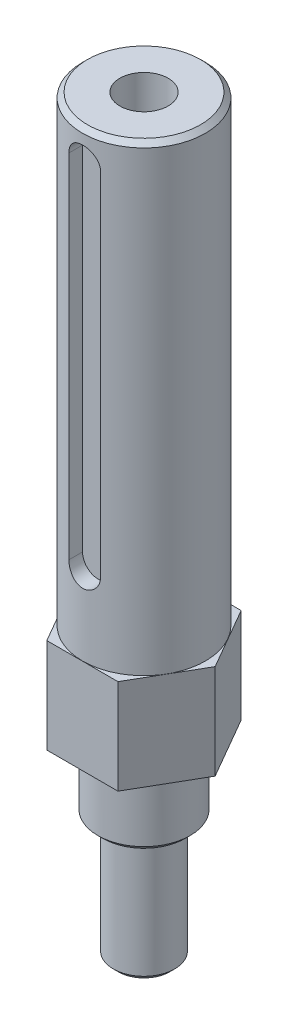
ISO-10303-21;
HEADER;
FILE_DESCRIPTION(('STEP AP214'),'2;1');
FILE_NAME('part.step','',(''),(''),'','','');
FILE_SCHEMA(('AUTOMOTIVE_DESIGN { 1 0 10303 214 1 1 1 1 }'));
ENDSEC;
DATA;
#1=APPLICATION_CONTEXT('core data for automotive mechanical design processes');
#2=APPLICATION_PROTOCOL_DEFINITION('international standard','automotive_design',2000,#1);
#3=PRODUCT_CONTEXT('',#1,'mechanical');
#4=PRODUCT('Part','Part','',(#3));
#5=PRODUCT_RELATED_PRODUCT_CATEGORY('part','',(#4));
#6=PRODUCT_DEFINITION_FORMATION('','',#4);
#7=PRODUCT_DEFINITION_CONTEXT('part definition',#1,'design');
#8=PRODUCT_DEFINITION('design','',#6,#7);
#9=PRODUCT_DEFINITION_SHAPE('','',#8);
#10=(LENGTH_UNIT() NAMED_UNIT(*) SI_UNIT(.MILLI.,.METRE.));
#11=(NAMED_UNIT(*) PLANE_ANGLE_UNIT() SI_UNIT($,.RADIAN.));
#12=(NAMED_UNIT(*) SI_UNIT($,.STERADIAN.) SOLID_ANGLE_UNIT());
#13=UNCERTAINTY_MEASURE_WITH_UNIT(LENGTH_MEASURE(1.E-05),#10,'distance_accuracy_value','');
#14=(GEOMETRIC_REPRESENTATION_CONTEXT(3) GLOBAL_UNCERTAINTY_ASSIGNED_CONTEXT((#13)) GLOBAL_UNIT_ASSIGNED_CONTEXT((#10,
#11,#12)) REPRESENTATION_CONTEXT('',''));
#15=CARTESIAN_POINT('',(0.,0.,0.));
#16=DIRECTION('',(0.,0.,1.));
#17=DIRECTION('',(1.,0.,0.));
#18=AXIS2_PLACEMENT_3D('',#15,#16,#17);
#19=CARTESIAN_POINT('',(-38.3071337161431,-29.591,-16.669011646302));
#20=DIRECTION('',(0.,1.,0.));
#21=DIRECTION('',(0.,0.,1.));
#22=AXIS2_PLACEMENT_3D('',#19,#20,#21);
#23=PLANE('',#22);
#24=CARTESIAN_POINT('',(-38.3071337161431,-29.5910000000958,-16.669011646302));
#25=DIRECTION('',(0.,1.,0.));
#26=DIRECTION('',(-1.,0.,0.));
#27=AXIS2_PLACEMENT_3D('',#24,#25,#26);
#28=CIRCLE('',#27,2.6542999999766);
#29=CARTESIAN_POINT('',(-40.9614337161197,-29.5910000000958,-16.669011646302));
#30=VERTEX_POINT('',#29);
#31=EDGE_CURVE('E20',#30,#30,#28,.T.);
#32=ORIENTED_EDGE('',*,*,#31,.F.);
#33=EDGE_LOOP('',(#32));
#34=FACE_BOUND('',#33,.T.);
#35=ADVANCED_FACE('F17',(#34),#23,.F.);
#36=CARTESIAN_POINT('',(-38.3071337161431,-29.0830000001279,-16.669011646302));
#37=DIRECTION('',(0.,1.,0.));
#38=DIRECTION('',(-1.,0.,0.));
#39=AXIS2_PLACEMENT_3D('',#36,#37,#38);
#40=CONICAL_SURFACE('',#39,3.16229999994458,0.785398163397448);
#41=CARTESIAN_POINT('',(-38.3071337161431,-29.083,-16.669011646302));
#42=DIRECTION('',(0.,-1.,0.));
#43=DIRECTION('',(0.,0.,-1.));
#44=AXIS2_PLACEMENT_3D('',#41,#42,#43);
#45=CIRCLE('',#44,3.1623);
#46=CARTESIAN_POINT('',(-38.3071337161431,-29.083,-19.831311646302));
#47=VERTEX_POINT('',#46);
#48=EDGE_CURVE('E116',#47,#47,#45,.F.);
#49=ORIENTED_EDGE('',*,*,#48,.F.);
#50=EDGE_LOOP('',(#49));
#51=FACE_BOUND('',#50,.T.);
#52=ORIENTED_EDGE('',*,*,#31,.T.);
#53=EDGE_LOOP('',(#52));
#54=FACE_BOUND('',#53,.T.);
#55=ADVANCED_FACE('F238',(#51,#54),#40,.T.);
#56=CARTESIAN_POINT('',(-38.3071337161431,-29.591,-16.669011646302));
#57=DIRECTION('',(0.,-1.,0.));
#58=DIRECTION('',(0.,0.,-1.));
#59=AXIS2_PLACEMENT_3D('',#56,#57,#58);
#60=CYLINDRICAL_SURFACE('',#59,3.1623);
#61=CARTESIAN_POINT('',(-38.3071337161431,-16.891,-16.669011646302));
#62=DIRECTION('',(0.,-1.,0.));
#63=DIRECTION('',(0.,0.,-1.));
#64=AXIS2_PLACEMENT_3D('',#61,#62,#63);
#65=CIRCLE('',#64,3.1623);
#66=CARTESIAN_POINT('',(-38.3071337161431,-16.891,-19.831311646302));
#67=VERTEX_POINT('',#66);
#68=EDGE_CURVE('E119',#67,#67,#65,.T.);
#69=ORIENTED_EDGE('',*,*,#68,.T.);
#70=EDGE_LOOP('',(#69));
#71=FACE_BOUND('',#70,.T.);
#72=ORIENTED_EDGE('',*,*,#48,.T.);
#73=EDGE_LOOP('',(#72));
#74=FACE_BOUND('',#73,.T.);
#75=ADVANCED_FACE('F225',(#71,#74),#60,.T.);
#76=CARTESIAN_POINT('',(-38.3071337161431,-16.891,-16.669011646302));
#77=DIRECTION('',(0.,1.,0.));
#78=DIRECTION('',(0.,0.,1.));
#79=AXIS2_PLACEMENT_3D('',#76,#77,#78);
#80=PLANE('',#79);
#81=CARTESIAN_POINT('',(-38.3071337161431,-16.8909999999869,-16.669011646302));
#82=DIRECTION('',(0.,1.,0.));
#83=DIRECTION('',(0.,0.,1.));
#84=AXIS2_PLACEMENT_3D('',#81,#82,#83);
#85=CIRCLE('',#84,4.24179999994759);
#86=CARTESIAN_POINT('',(-38.3071337161431,-16.8909999999869,-12.4272116463544));
#87=VERTEX_POINT('',#86);
#88=EDGE_CURVE('E107',#87,#87,#85,.T.);
#89=ORIENTED_EDGE('',*,*,#88,.F.);
#90=EDGE_LOOP('',(#89));
#91=FACE_BOUND('',#90,.T.);
#92=ORIENTED_EDGE('',*,*,#68,.F.);
#93=EDGE_LOOP('',(#92));
#94=FACE_BOUND('',#93,.T.);
#95=ADVANCED_FACE('F228',(#91,#94),#80,.F.);
#96=CARTESIAN_POINT('',(-38.3071337161431,-16.3830000000189,-16.669011646302));
#97=DIRECTION('',(0.,1.,0.));
#98=DIRECTION('',(0.,0.,1.));
#99=AXIS2_PLACEMENT_3D('',#96,#97,#98);
#100=CONICAL_SURFACE('',#99,4.74979999991557,0.785398163397448);
#101=CARTESIAN_POINT('',(-38.3071337161431,-16.383,-16.669011646302));
#102=DIRECTION('',(0.,-1.,0.));
#103=DIRECTION('',(0.,0.,-1.));
#104=AXIS2_PLACEMENT_3D('',#101,#102,#103);
#105=CIRCLE('',#104,4.7498);
#106=CARTESIAN_POINT('',(-38.3071337161431,-16.383,-21.418811646302));
#107=VERTEX_POINT('',#106);
#108=EDGE_CURVE('E101',#107,#107,#105,.F.);
#109=ORIENTED_EDGE('',*,*,#108,.F.);
#110=EDGE_LOOP('',(#109));
#111=FACE_BOUND('',#110,.T.);
#112=ORIENTED_EDGE('',*,*,#88,.T.);
#113=EDGE_LOOP('',(#112));
#114=FACE_BOUND('',#113,.T.);
#115=ADVANCED_FACE('F94',(#111,#114),#100,.T.);
#116=CARTESIAN_POINT('',(-38.3071337161431,31.7499999999313,-16.669011646302));
#117=DIRECTION('',(0.,1.,0.));
#118=DIRECTION('',(0.,0.,1.));
#119=AXIS2_PLACEMENT_3D('',#116,#117,#118);
#120=CONICAL_SURFACE('',#119,2.48792999984279,1.02974425854432);
#121=CARTESIAN_POINT('',(-38.3071337161431,30.2551008400656,-16.6690116461723));
#122=VERTEX_POINT('',#121);
#123=VERTEX_LOOP('',#122);
#124=FACE_BOUND('',#123,.T.);
#125=CARTESIAN_POINT('',(-38.3071337161431,31.75,-16.669011646302));
#126=DIRECTION('',(0.,1.,0.));
#127=DIRECTION('',(0.,0.,1.));
#128=AXIS2_PLACEMENT_3D('',#125,#126,#127);
#129=CIRCLE('',#128,2.48793);
#130=CARTESIAN_POINT('',(-38.3071337161431,31.75,-14.181081646302));
#131=VERTEX_POINT('',#130);
#132=EDGE_CURVE('E98',#131,#131,#129,.T.);
#133=ORIENTED_EDGE('',*,*,#132,.T.);
#134=EDGE_LOOP('',(#133));
#135=FACE_BOUND('',#134,.T.);
#136=ADVANCED_FACE('F90',(#124,#135),#120,.F.);
#137=CARTESIAN_POINT('',(-38.3071337161431,-16.891,-16.669011646302));
#138=DIRECTION('',(0.,-1.,0.));
#139=DIRECTION('',(0.,0.,-1.));
#140=AXIS2_PLACEMENT_3D('',#137,#138,#139);
#141=CYLINDRICAL_SURFACE('',#140,4.7498);
#142=CARTESIAN_POINT('',(-38.3071337161431,-9.779,-16.669011646302));
#143=DIRECTION('',(0.,-1.,0.));
#144=DIRECTION('',(0.,0.,-1.));
#145=AXIS2_PLACEMENT_3D('',#142,#143,#144);
#146=CIRCLE('',#145,4.7498);
#147=CARTESIAN_POINT('',(-38.3071337161431,-9.779,-21.418811646302));
#148=VERTEX_POINT('',#147);
#149=EDGE_CURVE('E100',#148,#148,#146,.T.);
#150=ORIENTED_EDGE('',*,*,#149,.T.);
#151=EDGE_LOOP('',(#150));
#152=FACE_BOUND('',#151,.T.);
#153=ORIENTED_EDGE('',*,*,#108,.T.);
#154=EDGE_LOOP('',(#153));
#155=FACE_BOUND('',#154,.T.);
#156=ADVANCED_FACE('F93',(#152,#155),#141,.T.);
#157=CARTESIAN_POINT('',(-38.3071337161431,47.625,-16.669011646302));
#158=DIRECTION('',(0.,1.,0.));
#159=DIRECTION('',(0.,0.,1.));
#160=AXIS2_PLACEMENT_3D('',#157,#158,#159);
#161=CYLINDRICAL_SURFACE('',#160,2.48793);
#162=CARTESIAN_POINT('',(-38.3071337161431,47.625,-16.669011646302));
#163=DIRECTION('',(0.,1.,0.));
#164=DIRECTION('',(0.,0.,1.));
#165=AXIS2_PLACEMENT_3D('',#162,#163,#164);
#166=CIRCLE('',#165,2.48793);
#167=CARTESIAN_POINT('',(-38.3071337161431,47.625,-14.181081646302));
#168=VERTEX_POINT('',#167);
#169=EDGE_CURVE('E104',#168,#168,#166,.T.);
#170=ORIENTED_EDGE('',*,*,#169,.T.);
#171=EDGE_LOOP('',(#170));
#172=FACE_BOUND('',#171,.T.);
#173=ORIENTED_EDGE('',*,*,#132,.F.);
#174=EDGE_LOOP('',(#173));
#175=FACE_BOUND('',#174,.T.);
#176=ADVANCED_FACE('F293',(#172,#175),#161,.F.);
#177=CARTESIAN_POINT('',(-38.3071337161431,-9.779,-3.96901164630201));
#178=DIRECTION('',(0.,1.,0.));
#179=DIRECTION('',(0.,0.,1.));
#180=AXIS2_PLACEMENT_3D('',#177,#178,#179);
#181=PLANE('',#180);
#182=DIRECTION('',(-0.5,0.,0.866025403784438));
#183=VECTOR('',#182,1.);
#184=CARTESIAN_POINT('',(-41.9733079254973,-9.779,-23.019011646302));
#185=LINE('',#184,#183);
#186=CARTESIAN_POINT('',(-41.9733079254973,-9.779,-23.019011646302));
#187=VERTEX_POINT('',#186);
#188=CARTESIAN_POINT('',(-45.6394821348514,-9.779,-16.669011646302));
#189=VERTEX_POINT('',#188);
#190=EDGE_CURVE('E186',#187,#189,#185,.T.);
#191=ORIENTED_EDGE('',*,*,#190,.F.);
#192=DIRECTION('',(-1.,0.,0.));
#193=VECTOR('',#192,1.);
#194=CARTESIAN_POINT('',(-34.640959506789,-9.779,-23.019011646302));
#195=LINE('',#194,#193);
#196=CARTESIAN_POINT('',(-34.640959506789,-9.779,-23.019011646302));
#197=VERTEX_POINT('',#196);
#198=EDGE_CURVE('E192',#197,#187,#195,.T.);
#199=ORIENTED_EDGE('',*,*,#198,.F.);
#200=DIRECTION('',(-0.5,0.,-0.866025403784438));
#201=VECTOR('',#200,1.);
#202=CARTESIAN_POINT('',(-30.9747852974349,-9.779,-16.669011646302));
#203=LINE('',#202,#201);
#204=CARTESIAN_POINT('',(-30.9747852974349,-9.779,-16.669011646302));
#205=VERTEX_POINT('',#204);
#206=EDGE_CURVE('E197',#205,#197,#203,.T.);
#207=ORIENTED_EDGE('',*,*,#206,.F.);
#208=DIRECTION('',(0.500000000000001,0.,-0.866025403784438));
#209=VECTOR('',#208,1.);
#210=CARTESIAN_POINT('',(-34.640959506789,-9.779,-10.319011646302));
#211=LINE('',#210,#209);
#212=CARTESIAN_POINT('',(-34.640959506789,-9.779,-10.319011646302));
#213=VERTEX_POINT('',#212);
#214=EDGE_CURVE('E202',#213,#205,#211,.T.);
#215=ORIENTED_EDGE('',*,*,#214,.F.);
#216=DIRECTION('',(1.,0.,0.));
#217=VECTOR('',#216,1.);
#218=CARTESIAN_POINT('',(-41.9733079254973,-9.779,-10.319011646302));
#219=LINE('',#218,#217);
#220=CARTESIAN_POINT('',(-41.9733079254973,-9.779,-10.319011646302));
#221=VERTEX_POINT('',#220);
#222=EDGE_CURVE('E207',#221,#213,#219,.T.);
#223=ORIENTED_EDGE('',*,*,#222,.F.);
#224=DIRECTION('',(0.5,0.,0.866025403784438));
#225=VECTOR('',#224,1.);
#226=CARTESIAN_POINT('',(-45.6394821348514,-9.779,-16.669011646302));
#227=LINE('',#226,#225);
#228=EDGE_CURVE('E69',#189,#221,#227,.T.);
#229=ORIENTED_EDGE('',*,*,#228,.F.);
#230=EDGE_LOOP('',(#191,#199,#207,#215,#223,#229));
#231=FACE_BOUND('',#230,.T.);
#232=ORIENTED_EDGE('',*,*,#149,.F.);
#233=EDGE_LOOP('',(#232));
#234=FACE_BOUND('',#233,.T.);
#235=ADVANCED_FACE('F303',(#231,#234),#181,.F.);
#236=CARTESIAN_POINT('',(-38.2944337161431,8.128,-11.944611646302));
#237=DIRECTION('',(0.,0.,1.));
#238=DIRECTION('',(1.,0.,0.));
#239=AXIS2_PLACEMENT_3D('',#236,#237,#238);
#240=PLANE('',#239);
#241=CARTESIAN_POINT('',(-38.2944337161431,44.45,-11.944611646302));
#242=DIRECTION('',(0.,0.,-1.));
#243=DIRECTION('',(-1.,0.,0.));
#244=AXIS2_PLACEMENT_3D('',#241,#242,#243);
#245=CIRCLE('',#244,1.6256);
#246=CARTESIAN_POINT('',(-36.6688337161431,44.45,-11.944611646302));
#247=VERTEX_POINT('',#246);
#248=CARTESIAN_POINT('',(-39.9200337161431,44.45,-11.944611646302));
#249=VERTEX_POINT('',#248);
#250=EDGE_CURVE('E179',#247,#249,#245,.F.);
#251=ORIENTED_EDGE('',*,*,#250,.T.);
#252=DIRECTION('',(0.,1.,0.));
#253=VECTOR('',#252,1.);
#254=CARTESIAN_POINT('',(-39.9200337161431,44.45,-11.944611646302));
#255=LINE('',#254,#253);
#256=CARTESIAN_POINT('',(-39.9200337161431,8.128,-11.944611646302));
#257=VERTEX_POINT('',#256);
#258=EDGE_CURVE('E60',#249,#257,#255,.F.);
#259=ORIENTED_EDGE('',*,*,#258,.T.);
#260=CARTESIAN_POINT('',(-38.2944337161431,8.128,-11.944611646302));
#261=DIRECTION('',(0.,0.,-1.));
#262=DIRECTION('',(-1.,0.,0.));
#263=AXIS2_PLACEMENT_3D('',#260,#261,#262);
#264=CIRCLE('',#263,1.6256);
#265=CARTESIAN_POINT('',(-36.6688337161431,8.128,-11.944611646302));
#266=VERTEX_POINT('',#265);
#267=EDGE_CURVE('E185',#257,#266,#264,.F.);
#268=ORIENTED_EDGE('',*,*,#267,.T.);
#269=DIRECTION('',(0.,1.,0.));
#270=VECTOR('',#269,1.);
#271=CARTESIAN_POINT('',(-36.6688337161431,8.128,-11.944611646302));
#272=LINE('',#271,#270);
#273=EDGE_CURVE('E165',#266,#247,#272,.T.);
#274=ORIENTED_EDGE('',*,*,#273,.T.);
#275=EDGE_LOOP('',(#251,#259,#268,#274));
#276=FACE_BOUND('',#275,.T.);
#277=ADVANCED_FACE('F312',(#276),#240,.T.);
#278=CARTESIAN_POINT('',(-38.3071337161431,47.625,-16.669011646302));
#279=DIRECTION('',(0.,-1.,0.));
#280=DIRECTION('',(0.,0.,-1.));
#281=AXIS2_PLACEMENT_3D('',#278,#279,#280);
#282=PLANE('',#281);
#283=CARTESIAN_POINT('',(-38.3071337161431,47.6249999999823,-16.669011646302));
#284=DIRECTION('',(0.,-1.,0.));
#285=DIRECTION('',(0.,0.,-1.));
#286=AXIS2_PLACEMENT_3D('',#283,#284,#285);
#287=CIRCLE('',#286,5.82930000000023);
#288=CARTESIAN_POINT('',(-38.3071337161431,47.6249999999823,-22.4983116463022));
#289=VERTEX_POINT('',#288);
#290=EDGE_CURVE('E167',#289,#289,#287,.T.);
#291=ORIENTED_EDGE('',*,*,#290,.F.);
#292=EDGE_LOOP('',(#291));
#293=FACE_BOUND('',#292,.T.);
#294=ORIENTED_EDGE('',*,*,#169,.F.);
#295=EDGE_LOOP('',(#294));
#296=FACE_BOUND('',#295,.T.);
#297=ADVANCED_FACE('F321',(#293,#296),#282,.F.);
#298=CARTESIAN_POINT('',(-45.6394821348514,-9.779,-16.669011646302));
#299=DIRECTION('',(-0.866025403784438,0.,0.5));
#300=DIRECTION('',(0.5,0.,0.866025403784438));
#301=AXIS2_PLACEMENT_3D('',#298,#299,#300);
#302=PLANE('',#301);
#303=ORIENTED_EDGE('',*,*,#228,.T.);
#304=DIRECTION('',(0.,1.,0.));
#305=VECTOR('',#304,1.);
#306=CARTESIAN_POINT('',(-41.9733079254973,-9.779,-10.319011646302));
#307=LINE('',#306,#305);
#308=CARTESIAN_POINT('',(-41.9733079254973,0.,-10.319011646302));
#309=VERTEX_POINT('',#308);
#310=EDGE_CURVE('E209',#309,#221,#307,.F.);
#311=ORIENTED_EDGE('',*,*,#310,.F.);
#312=DIRECTION('',(0.499999999999997,0.,0.86602540378444));
#313=VECTOR('',#312,1.);
#314=CARTESIAN_POINT('',(-45.6394821348514,0.,-16.669011646302));
#315=LINE('',#314,#313);
#316=CARTESIAN_POINT('',(-45.6394821348514,0.,-16.669011646302));
#317=VERTEX_POINT('',#316);
#318=EDGE_CURVE('E170',#317,#309,#315,.T.);
#319=ORIENTED_EDGE('',*,*,#318,.F.);
#320=DIRECTION('',(0.,1.,0.));
#321=VECTOR('',#320,1.);
#322=CARTESIAN_POINT('',(-45.6394821348514,-9.779,-16.669011646302));
#323=LINE('',#322,#321);
#324=EDGE_CURVE('E182',#189,#317,#323,.T.);
#325=ORIENTED_EDGE('',*,*,#324,.F.);
#326=EDGE_LOOP('',(#303,#311,#319,#325));
#327=FACE_BOUND('',#326,.T.);
#328=ADVANCED_FACE('F330',(#327),#302,.T.);
#329=CARTESIAN_POINT('',(-41.9733079254973,-9.779,-10.319011646302));
#330=DIRECTION('',(0.,0.,1.));
#331=DIRECTION('',(1.,0.,0.));
#332=AXIS2_PLACEMENT_3D('',#329,#330,#331);
#333=PLANE('',#332);
#334=ORIENTED_EDGE('',*,*,#222,.T.);
#335=DIRECTION('',(0.,1.,0.));
#336=VECTOR('',#335,1.);
#337=CARTESIAN_POINT('',(-34.640959506789,-9.779,-10.319011646302));
#338=LINE('',#337,#336);
#339=CARTESIAN_POINT('',(-34.640959506789,0.,-10.319011646302));
#340=VERTEX_POINT('',#339);
#341=EDGE_CURVE('E204',#340,#213,#338,.F.);
#342=ORIENTED_EDGE('',*,*,#341,.F.);
#343=DIRECTION('',(1.,0.,0.));
#344=VECTOR('',#343,1.);
#345=CARTESIAN_POINT('',(-38.3071337161431,0.,-10.319011646302));
#346=LINE('',#345,#344);
#347=EDGE_CURVE('E462',#309,#340,#346,.T.);
#348=ORIENTED_EDGE('',*,*,#347,.F.);
#349=ORIENTED_EDGE('',*,*,#310,.T.);
#350=EDGE_LOOP('',(#334,#342,#348,#349));
#351=FACE_BOUND('',#350,.T.);
#352=ADVANCED_FACE('F340',(#351),#333,.T.);
#353=CARTESIAN_POINT('',(-34.640959506789,-9.779,-10.319011646302));
#354=DIRECTION('',(0.866025403784438,0.,0.500000000000001));
#355=DIRECTION('',(0.500000000000001,0.,-0.866025403784438));
#356=AXIS2_PLACEMENT_3D('',#353,#354,#355);
#357=PLANE('',#356);
#358=ORIENTED_EDGE('',*,*,#214,.T.);
#359=DIRECTION('',(0.,1.,0.));
#360=VECTOR('',#359,1.);
#361=CARTESIAN_POINT('',(-30.9747852974349,-9.779,-16.669011646302));
#362=LINE('',#361,#360);
#363=CARTESIAN_POINT('',(-30.9747852974349,0.,-16.669011646302));
#364=VERTEX_POINT('',#363);
#365=EDGE_CURVE('E199',#364,#205,#362,.F.);
#366=ORIENTED_EDGE('',*,*,#365,.F.);
#367=DIRECTION('',(0.499999999999998,0.,-0.86602540378444));
#368=VECTOR('',#367,1.);
#369=CARTESIAN_POINT('',(-34.640959506789,0.,-10.319011646302));
#370=LINE('',#369,#368);
#371=EDGE_CURVE('E460',#340,#364,#370,.T.);
#372=ORIENTED_EDGE('',*,*,#371,.F.);
#373=ORIENTED_EDGE('',*,*,#341,.T.);
#374=EDGE_LOOP('',(#358,#366,#372,#373));
#375=FACE_BOUND('',#374,.T.);
#376=ADVANCED_FACE('F349',(#375),#357,.T.);
#377=CARTESIAN_POINT('',(-30.9747852974349,-9.779,-16.669011646302));
#378=DIRECTION('',(0.866025403784438,0.,-0.5));
#379=DIRECTION('',(-0.5,0.,-0.866025403784438));
#380=AXIS2_PLACEMENT_3D('',#377,#378,#379);
#381=PLANE('',#380);
#382=ORIENTED_EDGE('',*,*,#206,.T.);
#383=DIRECTION('',(0.,1.,0.));
#384=VECTOR('',#383,1.);
#385=CARTESIAN_POINT('',(-34.640959506789,-9.779,-23.019011646302));
#386=LINE('',#385,#384);
#387=CARTESIAN_POINT('',(-34.640959506789,0.,-23.019011646302));
#388=VERTEX_POINT('',#387);
#389=EDGE_CURVE('E194',#388,#197,#386,.F.);
#390=ORIENTED_EDGE('',*,*,#389,.F.);
#391=DIRECTION('',(-0.499999999999998,0.,-0.86602540378444));
#392=VECTOR('',#391,1.);
#393=CARTESIAN_POINT('',(-30.9747852974349,0.,-16.669011646302));
#394=LINE('',#393,#392);
#395=EDGE_CURVE('E457',#364,#388,#394,.T.);
#396=ORIENTED_EDGE('',*,*,#395,.F.);
#397=ORIENTED_EDGE('',*,*,#365,.T.);
#398=EDGE_LOOP('',(#382,#390,#396,#397));
#399=FACE_BOUND('',#398,.T.);
#400=ADVANCED_FACE('F359',(#399),#381,.T.);
#401=CARTESIAN_POINT('',(-34.640959506789,-9.779,-23.019011646302));
#402=DIRECTION('',(0.,0.,-1.));
#403=DIRECTION('',(-1.,0.,0.));
#404=AXIS2_PLACEMENT_3D('',#401,#402,#403);
#405=PLANE('',#404);
#406=ORIENTED_EDGE('',*,*,#198,.T.);
#407=DIRECTION('',(0.,1.,0.));
#408=VECTOR('',#407,1.);
#409=CARTESIAN_POINT('',(-41.9733079254973,-9.779,-23.019011646302));
#410=LINE('',#409,#408);
#411=CARTESIAN_POINT('',(-41.9733079254973,0.,-23.019011646302));
#412=VERTEX_POINT('',#411);
#413=EDGE_CURVE('E189',#412,#187,#410,.F.);
#414=ORIENTED_EDGE('',*,*,#413,.F.);
#415=DIRECTION('',(1.,0.,0.));
#416=VECTOR('',#415,1.);
#417=CARTESIAN_POINT('',(-38.3071337161431,0.,-23.019011646302));
#418=LINE('',#417,#416);
#419=EDGE_CURVE('E454',#388,#412,#418,.F.);
#420=ORIENTED_EDGE('',*,*,#419,.F.);
#421=ORIENTED_EDGE('',*,*,#389,.T.);
#422=EDGE_LOOP('',(#406,#414,#420,#421));
#423=FACE_BOUND('',#422,.T.);
#424=ADVANCED_FACE('F369',(#423),#405,.T.);
#425=CARTESIAN_POINT('',(-41.9733079254973,-9.779,-23.019011646302));
#426=DIRECTION('',(-0.866025403784438,0.,-0.5));
#427=DIRECTION('',(-0.5,0.,0.866025403784438));
#428=AXIS2_PLACEMENT_3D('',#425,#426,#427);
#429=PLANE('',#428);
#430=ORIENTED_EDGE('',*,*,#190,.T.);
#431=ORIENTED_EDGE('',*,*,#324,.T.);
#432=DIRECTION('',(-0.499999999999997,0.,0.86602540378444));
#433=VECTOR('',#432,1.);
#434=CARTESIAN_POINT('',(-41.9733079254973,0.,-23.019011646302));
#435=LINE('',#434,#433);
#436=EDGE_CURVE('E448',#412,#317,#435,.T.);
#437=ORIENTED_EDGE('',*,*,#436,.F.);
#438=ORIENTED_EDGE('',*,*,#413,.T.);
#439=EDGE_LOOP('',(#430,#431,#437,#438));
#440=FACE_BOUND('',#439,.T.);
#441=ADVANCED_FACE('F379',(#440),#429,.T.);
#442=CARTESIAN_POINT('',(-38.2944337161431,8.128,-11.944611646302));
#443=DIRECTION('',(0.,0.,-1.));
#444=DIRECTION('',(-1.,0.,0.));
#445=AXIS2_PLACEMENT_3D('',#442,#443,#444);
#446=CYLINDRICAL_SURFACE('',#445,1.6256);
#447=DIRECTION('',(0.,0.,-1.));
#448=VECTOR('',#447,1.);
#449=CARTESIAN_POINT('',(-36.6688337161431,8.128,-11.944611646302));
#450=LINE('',#449,#448);
#451=CARTESIAN_POINT('',(-36.6688337161431,8.128,-10.5471373908146));
#452=VERTEX_POINT('',#451);
#453=EDGE_CURVE('E171',#452,#266,#450,.T.);
#454=ORIENTED_EDGE('',*,*,#453,.T.);
#455=ORIENTED_EDGE('',*,*,#267,.F.);
#456=DIRECTION('',(0.,0.,1.));
#457=VECTOR('',#456,1.);
#458=CARTESIAN_POINT('',(-39.9200337161431,8.128,-11.944611646302));
#459=LINE('',#458,#457);
#460=CARTESIAN_POINT('',(-39.9200337161431,8.128,-10.5403963965086));
#461=VERTEX_POINT('',#460);
#462=EDGE_CURVE('E180',#257,#461,#459,.T.);
#463=ORIENTED_EDGE('',*,*,#462,.T.);
#464=CARTESIAN_POINT('',(-36.6688337161431,8.128,-10.5471373908145));
#465=CARTESIAN_POINT('',(-36.6688331091211,8.08308676956371,-10.5471405182756));
#466=CARTESIAN_POINT('',(-36.6706962457444,8.03819584710579,-10.5466386386075));
#467=CARTESIAN_POINT('',(-36.678123083811,7.94875075384002,-10.544657178719));
#468=CARTESIAN_POINT('',(-36.6836861318509,7.90419652497702,-10.5431777711299));
#469=CARTESIAN_POINT('',(-36.7058421889299,7.77171365718299,-10.5373329317424));
#470=CARTESIAN_POINT('',(-36.7279024841407,7.68469705223479,-10.5315605059615));
#471=CARTESIAN_POINT('',(-36.7858812894694,7.51576425655234,-10.5169352836991));
#472=CARTESIAN_POINT('',(-36.8217979695407,7.43384739394118,-10.5080828940112));
#473=CARTESIAN_POINT('',(-36.9064235148925,7.27715869016788,-10.4882944814857));
#474=CARTESIAN_POINT('',(-36.9551361907329,7.20238898644194,-10.4773578382385));
#475=CARTESIAN_POINT('',(-37.0651790130352,7.06041146347381,-10.4543405349337));
#476=CARTESIAN_POINT('',(-37.1267531150963,6.9933958943197,-10.4422406430928));
#477=CARTESIAN_POINT('',(-37.2602504893411,6.87051357145926,-10.4184118928208));
#478=CARTESIAN_POINT('',(-37.332175442116,6.81464863172077,-10.4066830950194));
#479=CARTESIAN_POINT('',(-37.4856823536156,6.71484661901967,-10.3846912962059));
#480=CARTESIAN_POINT('',(-37.5673945479932,6.67110387834963,-10.3744533014004));
#481=CARTESIAN_POINT('',(-37.737315272444,6.59805152083161,-10.3568041875293));
#482=CARTESIAN_POINT('',(-37.8255224799875,6.56873897496487,-10.349392494854));
#483=CARTESIAN_POINT('',(-38.0039517924375,6.5259911330542,-10.3383506178957));
#484=CARTESIAN_POINT('',(-38.0940916347339,6.51223266043925,-10.3346436552414));
#485=CARTESIAN_POINT('',(-38.2754741033013,6.49997199958884,-10.33114201955));
#486=CARTESIAN_POINT('',(-38.3667165781547,6.50146773984195,-10.331346815302));
#487=CARTESIAN_POINT('',(-38.5454211572052,6.51944303891249,-10.3355769701775));
#488=CARTESIAN_POINT('',(-38.6329215953238,6.5355663413539,-10.3395115906581));
#489=CARTESIAN_POINT('',(-38.8039342379249,6.58176879728094,-10.3506330859961));
#490=CARTESIAN_POINT('',(-38.8874462699313,6.61184855370274,-10.3578201013608));
#491=CARTESIAN_POINT('',(-39.0489852800161,6.68537246854931,-10.3747532647595));
#492=CARTESIAN_POINT('',(-39.1269564548947,6.72893387014941,-10.3845217491481));
#493=CARTESIAN_POINT('',(-39.2746033865798,6.82809453486509,-10.4055506745099));
#494=CARTESIAN_POINT('',(-39.3442778265794,6.88369570492251,-10.4168113517171));
#495=CARTESIAN_POINT('',(-39.4754264045037,7.00720919031457,-10.4399645081475));
#496=CARTESIAN_POINT('',(-39.5366140469918,7.07542434188233,-10.4518658492884));
#497=CARTESIAN_POINT('',(-39.646763902012,7.22128583319706,-10.4746645306899));
#498=CARTESIAN_POINT('',(-39.6957227485742,7.29893476086333,-10.4855615940037));
#499=CARTESIAN_POINT('',(-39.780241642922,7.46208264682457,-10.5051471793903));
#500=CARTESIAN_POINT('',(-39.8157175237757,7.54762690287324,-10.5138217214079));
#501=CARTESIAN_POINT('',(-39.8716495997895,7.72368981055705,-10.5277978935588));
#502=CARTESIAN_POINT('',(-39.8921281763138,7.8142008320946,-10.5331045482044));
#503=CARTESIAN_POINT('',(-39.9098554782561,7.94258621495673,-10.5377252188414));
#504=CARTESIAN_POINT('',(-39.9136728670132,7.97958937744427,-10.5387252733945));
#505=CARTESIAN_POINT('',(-39.9187591835783,8.05372245347115,-10.5400606165068));
#506=CARTESIAN_POINT('',(-39.9200322081481,8.09085206667289,-10.5403969736951));
#507=CARTESIAN_POINT('',(-39.9200337161431,8.12799999999999,-10.5403963965086));
#508=B_SPLINE_CURVE_WITH_KNOTS('',3,(#464,#465,#466,#467,#468,#469,#470,#471,#472,#473,#474,
#475,#476,#477,#478,#479,#480,#481,#482,#483,#484,#485,#486,#487,#488,#489,#490,#491,#492,#493,
#494,#495,#496,#497,#498,#499,#500,#501,#502,#503,#504,#505,#506,#507),.UNSPECIFIED.,.F.,.F.,(4,
2,2,2,2,2,2,2,2,2,2,2,2,2,2,2,2,2,2,2,2,4),(0.,0.134654405350341,0.269285037084385,
0.537753454328434,0.806186426423103,1.07469942681538,1.34886316604649,1.62307146954232,
1.90145018784777,2.17977237794728,2.45219883298771,2.72458829319893,2.99051670004281,
3.25645659639433,3.52477750993717,3.79314095312924,4.06906868353483,4.34507227941813,
4.62277157392892,4.90005559210715,5.0116194576775,5.12300354553407),.UNSPECIFIED.);
#509=EDGE_CURVE('E132',#452,#461,#508,.T.);
#510=ORIENTED_EDGE('',*,*,#509,.F.);
#511=EDGE_LOOP('',(#454,#455,#463,#510));
#512=FACE_BOUND('',#511,.T.);
#513=ADVANCED_FACE('F389',(#512),#446,.F.);
#514=CARTESIAN_POINT('',(-39.9200337161431,44.45,-11.944611646302));
#515=DIRECTION('',(-1.,0.,0.));
#516=DIRECTION('',(0.,0.,1.));
#517=AXIS2_PLACEMENT_3D('',#514,#515,#516);
#518=PLANE('',#517);
#519=ORIENTED_EDGE('',*,*,#462,.F.);
#520=ORIENTED_EDGE('',*,*,#258,.F.);
#521=DIRECTION('',(0.,0.,-1.));
#522=VECTOR('',#521,1.);
#523=CARTESIAN_POINT('',(-39.9200337161431,44.45,-11.944611646302));
#524=LINE('',#523,#522);
#525=CARTESIAN_POINT('',(-39.9200337161431,44.45,-10.5403963965086));
#526=VERTEX_POINT('',#525);
#527=EDGE_CURVE('E177',#249,#526,#524,.F.);
#528=ORIENTED_EDGE('',*,*,#527,.T.);
#529=DIRECTION('',(0.,1.,0.));
#530=VECTOR('',#529,1.);
#531=CARTESIAN_POINT('',(-39.9200337161431,47.625,-10.5403963965086));
#532=LINE('',#531,#530);
#533=EDGE_CURVE('E131',#461,#526,#532,.T.);
#534=ORIENTED_EDGE('',*,*,#533,.F.);
#535=EDGE_LOOP('',(#519,#520,#528,#534));
#536=FACE_BOUND('',#535,.T.);
#537=ADVANCED_FACE('F162',(#536),#518,.F.);
#538=CARTESIAN_POINT('',(-38.2944337161431,44.45,-11.944611646302));
#539=DIRECTION('',(0.,0.,-1.));
#540=DIRECTION('',(-1.,0.,0.));
#541=AXIS2_PLACEMENT_3D('',#538,#539,#540);
#542=CYLINDRICAL_SURFACE('',#541,1.6256);
#543=ORIENTED_EDGE('',*,*,#527,.F.);
#544=ORIENTED_EDGE('',*,*,#250,.F.);
#545=DIRECTION('',(0.,0.,-1.));
#546=VECTOR('',#545,1.);
#547=CARTESIAN_POINT('',(-36.6688337161431,44.45,-11.944611646302));
#548=LINE('',#547,#546);
#549=CARTESIAN_POINT('',(-36.6688337161431,44.45,-10.5471373908145));
#550=VERTEX_POINT('',#549);
#551=EDGE_CURVE('E35',#247,#550,#548,.F.);
#552=ORIENTED_EDGE('',*,*,#551,.T.);
#553=CARTESIAN_POINT('',(-39.9200337161431,44.45,-10.5403963965086));
#554=CARTESIAN_POINT('',(-39.9200342966573,44.4949428958685,-10.5403995117865));
#555=CARTESIAN_POINT('',(-39.9181687265864,44.5398634899368,-10.539905264155));
#556=CARTESIAN_POINT('',(-39.9107320050415,44.6293681179938,-10.5379541667355));
#557=CARTESIAN_POINT('',(-39.9051614957538,44.6739522089552,-10.5364974837691));
#558=CARTESIAN_POINT('',(-39.8829747375128,44.8065278904399,-10.5307428615743));
#559=CARTESIAN_POINT('',(-39.8608828924964,44.8936074815387,-10.5250599789878));
#560=CARTESIAN_POINT('',(-39.8028162092962,45.0626650406398,-10.5106687448808));
#561=CARTESIAN_POINT('',(-39.7668429900311,45.1446436022568,-10.501960746177));
#562=CARTESIAN_POINT('',(-39.6820785119233,45.3014457087652,-10.482511580741));
#563=CARTESIAN_POINT('',(-39.6332835846206,45.3762671975531,-10.4717698323724));
#564=CARTESIAN_POINT('',(-39.5230828848422,45.5182887679144,-10.4491999212503));
#565=CARTESIAN_POINT('',(-39.4614396865383,45.5853017613422,-10.437354037194));
#566=CARTESIAN_POINT('',(-39.3277969315994,45.7081636940625,-10.4140766777982));
#567=CARTESIAN_POINT('',(-39.2557957331914,45.764010860179,-10.4026452685146));
#568=CARTESIAN_POINT('',(-39.1022087890489,45.8637092528196,-10.3813003179096));
#569=CARTESIAN_POINT('',(-39.0205009852739,45.9073780181532,-10.3714107517298));
#570=CARTESIAN_POINT('',(-38.8506121800317,45.9802878469797,-10.3544825078088));
#571=CARTESIAN_POINT('',(-38.7624325107971,46.0095318702878,-10.3474432452665));
#572=CARTESIAN_POINT('',(-38.5840987141795,46.0521529540764,-10.3371505233864));
#573=CARTESIAN_POINT('',(-38.4940268868594,46.0658553195803,-10.3338194754991));
#574=CARTESIAN_POINT('',(-38.3128047711619,46.0780301649838,-10.3310667082296));
#575=CARTESIAN_POINT('',(-38.2216546255133,46.0765046384449,-10.331644477121));
#576=CARTESIAN_POINT('',(-38.0430824369201,46.0584984800285,-10.3365991139454));
#577=CARTESIAN_POINT('',(-37.9556228632021,46.042362530716,-10.3408883203501));
#578=CARTESIAN_POINT('',(-37.7847018283722,45.9961525094495,-10.3527010486973));
#579=CARTESIAN_POINT('',(-37.701240558778,45.9660777705658,-10.3602247253984));
#580=CARTESIAN_POINT('',(-37.5397307329446,45.8925499887307,-10.3778166769934));
#581=CARTESIAN_POINT('',(-37.4617436433396,45.8489679899693,-10.3879093044764));
#582=CARTESIAN_POINT('',(-37.314071577628,45.7497619186976,-10.4095566387859));
#583=CARTESIAN_POINT('',(-37.2443879467488,45.6941358990599,-10.4211115818958));
#584=CARTESIAN_POINT('',(-37.1132027310435,45.5705441799298,-10.4448269184039));
#585=CARTESIAN_POINT('',(-37.0519912708063,45.5022717285907,-10.4569951801552));
#586=CARTESIAN_POINT('',(-36.9418075945258,45.3562789018919,-10.4802769393556));
#587=CARTESIAN_POINT('',(-36.8928387299798,45.2785559480266,-10.491390147461));
#588=CARTESIAN_POINT('',(-36.8083430862911,45.1152892673199,-10.511341600307));
#589=CARTESIAN_POINT('',(-36.7728928860197,45.0297042970576,-10.5201667966115));
#590=CARTESIAN_POINT('',(-36.7170226434693,44.8535548841049,-10.5343752995792));
#591=CARTESIAN_POINT('',(-36.6965799849228,44.7629981561074,-10.5397637837302));
#592=CARTESIAN_POINT('',(-36.678934313829,44.6347074359211,-10.5444417315253));
#593=CARTESIAN_POINT('',(-36.675146057674,44.597844746324,-10.5454509844942));
#594=CARTESIAN_POINT('',(-36.6700985458206,44.5239939299208,-10.5467985493435));
#595=CARTESIAN_POINT('',(-36.6688352373897,44.4870060997345,-10.5471379363985));
#596=CARTESIAN_POINT('',(-36.6688337161431,44.45,-10.5471373908145));
#597=B_SPLINE_CURVE_WITH_KNOTS('',3,(#553,#554,#555,#556,#557,#558,#559,#560,#561,#562,#563,
#564,#565,#566,#567,#568,#569,#570,#571,#572,#573,#574,#575,#576,#577,#578,#579,#580,#581,#582,
#583,#584,#585,#586,#587,#588,#589,#590,#591,#592,#593,#594,#595,#596),.UNSPECIFIED.,.F.,.F.,(4,
2,2,2,2,2,2,2,2,2,2,2,2,2,2,2,2,2,2,2,2,4),(0.,0.134743413677404,0.269463478034835,
0.538120206051228,0.806745611374378,1.07544795782098,1.3496437536919,1.62388305837486,
1.90203387737441,2.18012759879859,2.45228638862256,2.72440954920778,2.99027554080117,
3.25615425460333,3.52465390004455,3.79319698562672,4.06940096631474,4.34568047720758,
4.62350256235711,4.90090510713658,5.0120425381203,5.12300144138299),.UNSPECIFIED.);
#598=EDGE_CURVE('E122',#526,#550,#597,.T.);
#599=ORIENTED_EDGE('',*,*,#598,.F.);
#600=EDGE_LOOP('',(#543,#544,#552,#599));
#601=FACE_BOUND('',#600,.T.);
#602=ADVANCED_FACE('F138',(#601),#542,.F.);
#603=CARTESIAN_POINT('',(-36.6688337161431,8.128,-11.944611646302));
#604=DIRECTION('',(1.,0.,0.));
#605=DIRECTION('',(0.,0.,-1.));
#606=AXIS2_PLACEMENT_3D('',#603,#604,#605);
#607=PLANE('',#606);
#608=ORIENTED_EDGE('',*,*,#551,.F.);
#609=ORIENTED_EDGE('',*,*,#273,.F.);
#610=ORIENTED_EDGE('',*,*,#453,.F.);
#611=DIRECTION('',(0.,1.,0.));
#612=VECTOR('',#611,1.);
#613=CARTESIAN_POINT('',(-36.6688337161431,47.625,-10.5471373908146));
#614=LINE('',#613,#612);
#615=EDGE_CURVE('E130',#550,#452,#614,.F.);
#616=ORIENTED_EDGE('',*,*,#615,.F.);
#617=EDGE_LOOP('',(#608,#609,#610,#616));
#618=FACE_BOUND('',#617,.T.);
#619=ADVANCED_FACE('F154',(#618),#607,.F.);
#620=CARTESIAN_POINT('',(-38.3071337161431,47.1169999999574,-16.669011646302));
#621=DIRECTION('',(0.,-1.,0.));
#622=DIRECTION('',(0.,0.,-1.));
#623=AXIS2_PLACEMENT_3D('',#620,#621,#622);
#624=CONICAL_SURFACE('',#623,6.33729999996821,0.7853981633415);
#625=CARTESIAN_POINT('',(-38.3071337161431,47.117,-16.669011646302));
#626=DIRECTION('',(0.,1.,0.));
#627=DIRECTION('',(0.,0.,1.));
#628=AXIS2_PLACEMENT_3D('',#625,#626,#627);
#629=CIRCLE('',#628,6.3373);
#630=CARTESIAN_POINT('',(-38.3071337161431,47.117,-10.331711646302));
#631=VERTEX_POINT('',#630);
#632=EDGE_CURVE('E26',#631,#631,#629,.F.);
#633=ORIENTED_EDGE('',*,*,#632,.F.);
#634=EDGE_LOOP('',(#633));
#635=FACE_BOUND('',#634,.T.);
#636=ORIENTED_EDGE('',*,*,#290,.T.);
#637=EDGE_LOOP('',(#636));
#638=FACE_BOUND('',#637,.T.);
#639=ADVANCED_FACE('F151',(#635,#638),#624,.T.);
#640=CARTESIAN_POINT('',(-38.3071337161431,0.,-3.96901164630201));
#641=DIRECTION('',(0.,1.,0.));
#642=DIRECTION('',(0.,0.,1.));
#643=AXIS2_PLACEMENT_3D('',#640,#641,#642);
#644=PLANE('',#643);
#645=ORIENTED_EDGE('',*,*,#419,.T.);
#646=ORIENTED_EDGE('',*,*,#436,.T.);
#647=ORIENTED_EDGE('',*,*,#318,.T.);
#648=ORIENTED_EDGE('',*,*,#347,.T.);
#649=ORIENTED_EDGE('',*,*,#371,.T.);
#650=ORIENTED_EDGE('',*,*,#395,.T.);
#651=EDGE_LOOP('',(#645,#646,#647,#648,#649,#650));
#652=FACE_BOUND('',#651,.T.);
#653=CARTESIAN_POINT('',(-38.3071337161431,0.,-16.669011646302));
#654=DIRECTION('',(0.,1.,0.));
#655=DIRECTION('',(0.,0.,1.));
#656=AXIS2_PLACEMENT_3D('',#653,#654,#655);
#657=CIRCLE('',#656,6.3373);
#658=CARTESIAN_POINT('',(-38.3071337161431,0.,-10.331711646302));
#659=VERTEX_POINT('',#658);
#660=EDGE_CURVE('E11',#659,#659,#657,.T.);
#661=ORIENTED_EDGE('',*,*,#660,.F.);
#662=EDGE_LOOP('',(#661));
#663=FACE_BOUND('',#662,.T.);
#664=ADVANCED_FACE('F146',(#652,#663),#644,.T.);
#665=CARTESIAN_POINT('',(-38.3071337161431,47.625,-16.669011646302));
#666=DIRECTION('',(0.,1.,0.));
#667=DIRECTION('',(0.,0.,1.));
#668=AXIS2_PLACEMENT_3D('',#665,#666,#667);
#669=CYLINDRICAL_SURFACE('',#668,6.3373);
#670=ORIENTED_EDGE('',*,*,#660,.T.);
#671=EDGE_LOOP('',(#670));
#672=FACE_BOUND('',#671,.T.);
#673=ORIENTED_EDGE('',*,*,#632,.T.);
#674=EDGE_LOOP('',(#673));
#675=FACE_BOUND('',#674,.T.);
#676=ORIENTED_EDGE('',*,*,#598,.T.);
#677=ORIENTED_EDGE('',*,*,#615,.T.);
#678=ORIENTED_EDGE('',*,*,#509,.T.);
#679=ORIENTED_EDGE('',*,*,#533,.T.);
#680=EDGE_LOOP('',(#676,#677,#678,#679));
#681=FACE_BOUND('',#680,.T.);
#682=ADVANCED_FACE('F142',(#672,#675,#681),#669,.T.);
#683=CLOSED_SHELL('',(#35,#55,#75,#95,#115,#136,#156,#176,#235,#277,#297,#328,#352,#376,#400,
#424,#441,#513,#537,#602,#619,#639,#664,#682));
#684=MANIFOLD_SOLID_BREP('B1',#683);
#685=ADVANCED_BREP_SHAPE_REPRESENTATION('',(#18,#684),#14);
#686=SHAPE_DEFINITION_REPRESENTATION(#9,#685);
ENDSEC;
END-ISO-10303-21;
